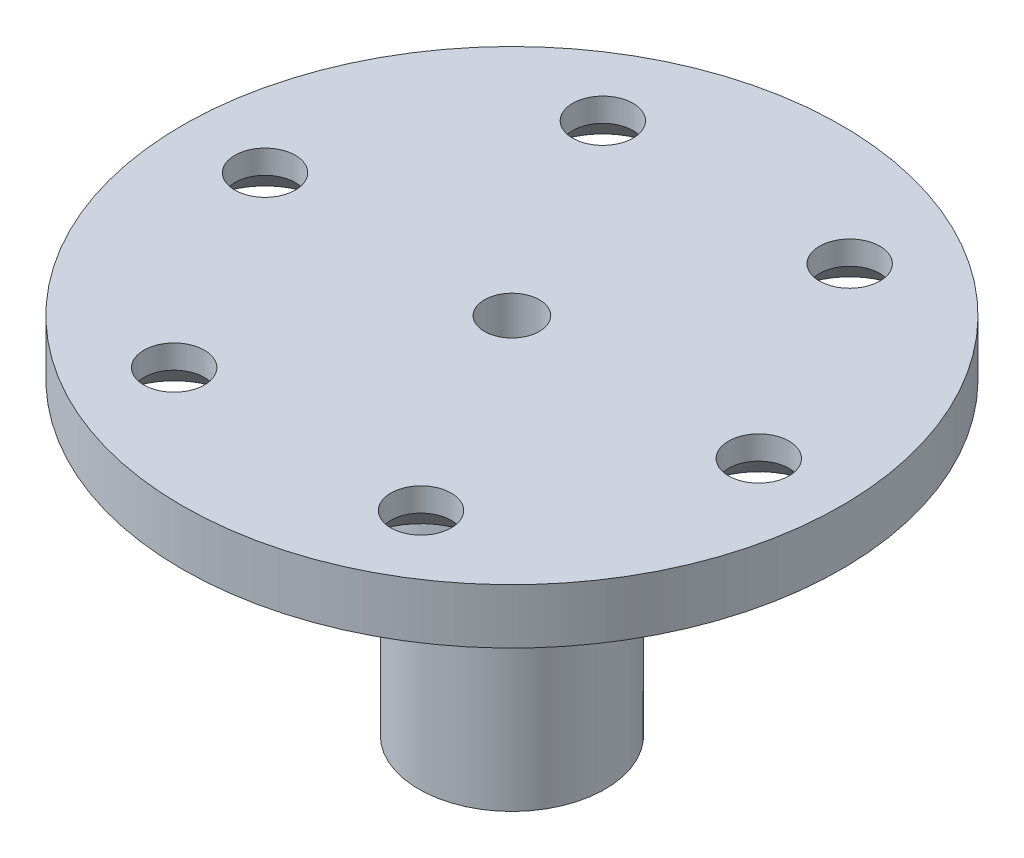
ISO-10303-21;
HEADER;
FILE_DESCRIPTION(('STEP AP214'),'2;1');
FILE_NAME('part.step','',(''),(''),'','','');
FILE_SCHEMA(('AUTOMOTIVE_DESIGN { 1 0 10303 214 1 1 1 1 }'));
ENDSEC;
DATA;
#1=APPLICATION_CONTEXT('core data for automotive mechanical design processes');
#2=APPLICATION_PROTOCOL_DEFINITION('international standard','automotive_design',2000,#1);
#3=PRODUCT_CONTEXT('',#1,'mechanical');
#4=PRODUCT('Part','Part','',(#3));
#5=PRODUCT_RELATED_PRODUCT_CATEGORY('part','',(#4));
#6=PRODUCT_DEFINITION_FORMATION('','',#4);
#7=PRODUCT_DEFINITION_CONTEXT('part definition',#1,'design');
#8=PRODUCT_DEFINITION('design','',#6,#7);
#9=PRODUCT_DEFINITION_SHAPE('','',#8);
#10=(LENGTH_UNIT() NAMED_UNIT(*) SI_UNIT(.MILLI.,.METRE.));
#11=(NAMED_UNIT(*) PLANE_ANGLE_UNIT() SI_UNIT($,.RADIAN.));
#12=(NAMED_UNIT(*) SI_UNIT($,.STERADIAN.) SOLID_ANGLE_UNIT());
#13=UNCERTAINTY_MEASURE_WITH_UNIT(LENGTH_MEASURE(1.E-05),#10,'distance_accuracy_value','');
#14=(GEOMETRIC_REPRESENTATION_CONTEXT(3) GLOBAL_UNCERTAINTY_ASSIGNED_CONTEXT((#13)) GLOBAL_UNIT_ASSIGNED_CONTEXT((#10,
#11,#12)) REPRESENTATION_CONTEXT('',''));
#15=CARTESIAN_POINT('',(0.,0.,0.));
#16=DIRECTION('',(0.,0.,1.));
#17=DIRECTION('',(1.,0.,0.));
#18=AXIS2_PLACEMENT_3D('',#15,#16,#17);
#19=CARTESIAN_POINT('',(0.,29.1,0.));
#20=DIRECTION('',(0.,1.,0.));
#21=DIRECTION('',(0.,0.,1.));
#22=AXIS2_PLACEMENT_3D('',#19,#20,#21);
#23=PLANE('',#22);
#24=CARTESIAN_POINT('',(0.,29.1,0.));
#25=DIRECTION('',(0.,1.,0.));
#26=DIRECTION('',(0.,0.,1.));
#27=AXIS2_PLACEMENT_3D('',#24,#25,#26);
#28=CIRCLE('',#27,30.);
#29=CARTESIAN_POINT('',(0.,29.1,30.));
#30=VERTEX_POINT('',#29);
#31=EDGE_CURVE('E235',#30,#30,#28,.T.);
#32=ORIENTED_EDGE('',*,*,#31,.T.);
#33=EDGE_LOOP('',(#32));
#34=FACE_BOUND('',#33,.T.);
#35=CARTESIAN_POINT('',(0.,29.1,0.));
#36=DIRECTION('',(0.,1.,0.));
#37=DIRECTION('',(0.,0.,1.));
#38=AXIS2_PLACEMENT_3D('',#35,#36,#37);
#39=CIRCLE('',#38,2.5);
#40=CARTESIAN_POINT('',(0.,29.1,2.5));
#41=VERTEX_POINT('',#40);
#42=EDGE_CURVE('E232',#41,#41,#39,.T.);
#43=ORIENTED_EDGE('',*,*,#42,.F.);
#44=EDGE_LOOP('',(#43));
#45=FACE_BOUND('',#44,.T.);
#46=CARTESIAN_POINT('',(-22.4999805563701,29.1,-0.0295797729116826));
#47=DIRECTION('',(0.,-1.,0.));
#48=DIRECTION('',(0.,0.,-1.));
#49=AXIS2_PLACEMENT_3D('',#46,#47,#48);
#50=CIRCLE('',#49,2.75);
#51=CARTESIAN_POINT('',(-22.4999805563701,29.1,-2.77957977291168));
#52=VERTEX_POINT('',#51);
#53=EDGE_CURVE('E229',#52,#52,#50,.T.);
#54=ORIENTED_EDGE('',*,*,#53,.T.);
#55=EDGE_LOOP('',(#54));
#56=FACE_BOUND('',#55,.T.);
#57=CARTESIAN_POINT('',(-11.2243734434054,29.1,-19.5003446329283));
#58=DIRECTION('',(0.,-1.,0.));
#59=DIRECTION('',(0.,0.,-1.));
#60=AXIS2_PLACEMENT_3D('',#57,#58,#59);
#61=CIRCLE('',#60,2.75);
#62=CARTESIAN_POINT('',(-11.2243734434054,29.1,-22.2503446329283));
#63=VERTEX_POINT('',#62);
#64=EDGE_CURVE('E220',#63,#63,#61,.T.);
#65=ORIENTED_EDGE('',*,*,#64,.T.);
#66=EDGE_LOOP('',(#65));
#67=FACE_BOUND('',#66,.T.);
#68=CARTESIAN_POINT('',(11.2756071129648,29.1,-19.4707648600166));
#69=DIRECTION('',(0.,-1.,0.));
#70=DIRECTION('',(0.,0.,-1.));
#71=AXIS2_PLACEMENT_3D('',#68,#69,#70);
#72=CIRCLE('',#71,2.75);
#73=CARTESIAN_POINT('',(11.2756071129648,29.1,-22.2207648600166));
#74=VERTEX_POINT('',#73);
#75=EDGE_CURVE('E211',#74,#74,#72,.T.);
#76=ORIENTED_EDGE('',*,*,#75,.T.);
#77=EDGE_LOOP('',(#76));
#78=FACE_BOUND('',#77,.T.);
#79=CARTESIAN_POINT('',(22.4999805563701,29.1,0.029579772911672));
#80=DIRECTION('',(0.,-1.,0.));
#81=DIRECTION('',(0.,0.,-1.));
#82=AXIS2_PLACEMENT_3D('',#79,#80,#81);
#83=CIRCLE('',#82,2.75);
#84=CARTESIAN_POINT('',(22.4999805563701,29.1,-2.72042022708833));
#85=VERTEX_POINT('',#84);
#86=EDGE_CURVE('E202',#85,#85,#83,.T.);
#87=ORIENTED_EDGE('',*,*,#86,.T.);
#88=EDGE_LOOP('',(#87));
#89=FACE_BOUND('',#88,.T.);
#90=CARTESIAN_POINT('',(11.2243734434054,29.1,19.5003446329283));
#91=DIRECTION('',(0.,-1.,0.));
#92=DIRECTION('',(0.,0.,-1.));
#93=AXIS2_PLACEMENT_3D('',#90,#91,#92);
#94=CIRCLE('',#93,2.75);
#95=CARTESIAN_POINT('',(11.2243734434054,29.1,16.7503446329283));
#96=VERTEX_POINT('',#95);
#97=EDGE_CURVE('E193',#96,#96,#94,.T.);
#98=ORIENTED_EDGE('',*,*,#97,.T.);
#99=EDGE_LOOP('',(#98));
#100=FACE_BOUND('',#99,.T.);
#101=CARTESIAN_POINT('',(-11.2756071129648,29.1,19.4707648600166));
#102=DIRECTION('',(0.,-1.,0.));
#103=DIRECTION('',(0.,0.,-1.));
#104=AXIS2_PLACEMENT_3D('',#101,#102,#103);
#105=CIRCLE('',#104,2.75);
#106=CARTESIAN_POINT('',(-11.2756071129648,29.1,16.7207648600166));
#107=VERTEX_POINT('',#106);
#108=EDGE_CURVE('E184',#107,#107,#105,.T.);
#109=ORIENTED_EDGE('',*,*,#108,.T.);
#110=EDGE_LOOP('',(#109));
#111=FACE_BOUND('',#110,.T.);
#112=ADVANCED_FACE('F38',(#34,#45,#56,#67,#78,#89,#100,#111),#23,.T.);
#113=CARTESIAN_POINT('',(0.,21.1,0.));
#114=DIRECTION('',(0.,1.,0.));
#115=DIRECTION('',(0.,0.,1.));
#116=AXIS2_PLACEMENT_3D('',#113,#114,#115);
#117=PLANE('',#116);
#118=CARTESIAN_POINT('',(0.,21.1,0.));
#119=DIRECTION('',(0.,1.,0.));
#120=DIRECTION('',(0.,0.,1.));
#121=AXIS2_PLACEMENT_3D('',#118,#119,#120);
#122=CIRCLE('',#121,12.5);
#123=CARTESIAN_POINT('',(0.,21.1,12.5));
#124=VERTEX_POINT('',#123);
#125=EDGE_CURVE('E83',#124,#124,#122,.T.);
#126=ORIENTED_EDGE('',*,*,#125,.F.);
#127=EDGE_LOOP('',(#126));
#128=FACE_BOUND('',#127,.T.);
#129=CARTESIAN_POINT('',(0.,21.1,0.));
#130=DIRECTION('',(0.,1.,0.));
#131=DIRECTION('',(0.,0.,1.));
#132=AXIS2_PLACEMENT_3D('',#129,#130,#131);
#133=CIRCLE('',#132,8.8);
#134=CARTESIAN_POINT('',(0.,21.1,8.8));
#135=VERTEX_POINT('',#134);
#136=EDGE_CURVE('E11',#135,#135,#133,.F.);
#137=ORIENTED_EDGE('',*,*,#136,.F.);
#138=EDGE_LOOP('',(#137));
#139=FACE_BOUND('',#138,.T.);
#140=ADVANCED_FACE('F119',(#128,#139),#117,.F.);
#141=CARTESIAN_POINT('',(0.,24.1,0.));
#142=DIRECTION('',(0.,-1.,0.));
#143=DIRECTION('',(0.,0.,-1.));
#144=AXIS2_PLACEMENT_3D('',#141,#142,#143);
#145=CYLINDRICAL_SURFACE('',#144,8.475);
#146=CARTESIAN_POINT('',(-8.40265977820583,10.,-1.10495866516446));
#147=CARTESIAN_POINT('',(-8.40266087968201,10.0698021096686,-1.10495575260072));
#148=CARTESIAN_POINT('',(-8.40343959515885,10.1396450759456,-1.09907774279233));
#149=CARTESIAN_POINT('',(-8.40645987454756,10.2773792495136,-1.07572796270456));
#150=CARTESIAN_POINT('',(-8.40870287629376,10.3452684698697,-1.05824479662926));
#151=CARTESIAN_POINT('',(-8.41436661369625,10.4770814922153,-1.01222204446264));
#152=CARTESIAN_POINT('',(-8.41778645663337,10.5410082567606,-0.983690837060908));
#153=CARTESIAN_POINT('',(-8.42537618391265,10.6631682440306,-0.916407125221118));
#154=CARTESIAN_POINT('',(-8.42954596228254,10.7214022693957,-0.877656064575271));
#155=CARTESIAN_POINT('',(-8.43814577096455,10.8309840493727,-0.790719075382072));
#156=CARTESIAN_POINT('',(-8.44257740354501,10.8822813243681,-0.742469669234943));
#157=CARTESIAN_POINT('',(-8.45110969247849,10.9760961628166,-0.638050632810637));
#158=CARTESIAN_POINT('',(-8.45521033081964,11.0186132486699,-0.58188057196774));
#159=CARTESIAN_POINT('',(-8.4625594986926,11.0938465481889,-0.462898840503435));
#160=CARTESIAN_POINT('',(-8.4658039848557,11.1265163555569,-0.400057553202238));
#161=CARTESIAN_POINT('',(-8.47095748332992,11.180829980343,-0.269726719038009));
#162=CARTESIAN_POINT('',(-8.47286656391731,11.2024743614508,-0.202237410011593));
#163=CARTESIAN_POINT('',(-8.47502585391505,11.2339699207795,-0.0650505909392129));
#164=CARTESIAN_POINT('',(-8.4752880060341,11.2439055763164,0.00462733051050558));
#165=CARTESIAN_POINT('',(-8.47405468213007,11.2519639016265,0.144645705771626));
#166=CARTESIAN_POINT('',(-8.47255930073161,11.2500872073462,0.214986123712338));
#167=CARTESIAN_POINT('',(-8.46789616018839,11.23464088347,0.353757257573251));
#168=CARTESIAN_POINT('',(-8.46474147318982,11.2211621348025,0.422198559194704));
#169=CARTESIAN_POINT('',(-8.45701954778459,11.1830369047029,0.55581164001434));
#170=CARTESIAN_POINT('',(-8.45245227400791,11.1583901436256,0.620983337296773));
#171=CARTESIAN_POINT('',(-8.44229612601306,11.0985350932331,0.746487534462836));
#172=CARTESIAN_POINT('',(-8.4367035692072,11.0632884293866,0.806801424520823));
#173=CARTESIAN_POINT('',(-8.42503714948996,10.983262102557,0.920682276639198));
#174=CARTESIAN_POINT('',(-8.41896325594732,10.9384818325692,0.974248808749486));
#175=CARTESIAN_POINT('',(-8.40686763789832,10.8401528650004,1.07365623236012));
#176=CARTESIAN_POINT('',(-8.40084695872408,10.7865248352207,1.11941881465837));
#177=CARTESIAN_POINT('',(-8.38952787631131,10.6722925047531,1.2013166081916));
#178=CARTESIAN_POINT('',(-8.38422947724583,10.6116881637628,1.2374517638044));
#179=CARTESIAN_POINT('',(-8.37490169239175,10.4851431993581,1.29908572786766));
#180=CARTESIAN_POINT('',(-8.3708732427825,10.4191986840822,1.32457669412337));
#181=CARTESIAN_POINT('',(-8.36451965781908,10.2838887107434,1.36412642662729));
#182=CARTESIAN_POINT('',(-8.36219440659687,10.2145234857331,1.37818597055867));
#183=CARTESIAN_POINT('',(-8.35951102423509,10.0750373488574,1.39437015523803));
#184=CARTESIAN_POINT('',(-8.35913465936228,10.0049296142079,1.39660542785582));
#185=CARTESIAN_POINT('',(-8.36033999190899,9.86533950735559,1.38937149181975));
#186=CARTESIAN_POINT('',(-8.36192163065461,9.79585711647639,1.3799026338941));
#187=CARTESIAN_POINT('',(-8.36686198726345,9.65983249494688,1.34962089609604));
#188=CARTESIAN_POINT('',(-8.37021209357493,9.59327769520735,1.32886297363424));
#189=CARTESIAN_POINT('',(-8.37833493480757,9.46460145689977,1.27664512342038));
#190=CARTESIAN_POINT('',(-8.38310773783679,9.40248023075457,1.24518468330165));
#191=CARTESIAN_POINT('',(-8.39362726551885,9.28393676385411,1.17218219507671));
#192=CARTESIAN_POINT('',(-8.39938083449809,9.22755935608675,1.13056834437198));
#193=CARTESIAN_POINT('',(-8.41125568515944,9.12256437675577,1.03853280728645));
#194=CARTESIAN_POINT('',(-8.41737698691136,9.07394722925538,0.988110639885974));
#195=CARTESIAN_POINT('',(-8.42943051223916,8.98545538718084,0.879394965283215));
#196=CARTESIAN_POINT('',(-8.4353608194275,8.94565414145514,0.821041419397263));
#197=CARTESIAN_POINT('',(-8.44639864564639,8.87643525951553,0.698398400154137));
#198=CARTESIAN_POINT('',(-8.45150618657243,8.84701734695492,0.634109084831656));
#199=CARTESIAN_POINT('',(-8.46039980760455,8.79951798300223,0.501644289965096));
#200=CARTESIAN_POINT('',(-8.46419057593625,8.7813961261953,0.433483624189252));
#201=CARTESIAN_POINT('',(-8.47014690048077,8.75687244361054,0.295017738543557));
#202=CARTESIAN_POINT('',(-8.47231256031506,8.75046987054093,0.22471265570526));
#203=CARTESIAN_POINT('',(-8.47486377929159,8.74958427740071,0.0846650136220495));
#204=CARTESIAN_POINT('',(-8.47526602695886,8.75498878245746,0.0149234434561492));
#205=CARTESIAN_POINT('',(-8.47439146987154,8.77732315752283,-0.122676588822249));
#206=CARTESIAN_POINT('',(-8.47311466997503,8.79425299418463,-0.190535056382632));
#207=CARTESIAN_POINT('',(-8.46912211936292,8.83911803405105,-0.322409941370452));
#208=CARTESIAN_POINT('',(-8.46640735310778,8.86704570456749,-0.3864289540252));
#209=CARTESIAN_POINT('',(-8.4599292748322,8.93310170420444,-0.508908055053001));
#210=CARTESIAN_POINT('',(-8.45616593104755,8.97123034233808,-0.567367974954344));
#211=CARTESIAN_POINT('',(-8.44804861389263,9.05701371281035,-0.677634417512913));
#212=CARTESIAN_POINT('',(-8.44368960122369,9.10475157284222,-0.729375904548525));
#213=CARTESIAN_POINT('',(-8.43496680683743,9.20822345584385,-0.82415486816626));
#214=CARTESIAN_POINT('',(-8.43060302424051,9.26395935414369,-0.86719029768751));
#215=CARTESIAN_POINT('',(-8.42240168433913,9.38219974561723,-0.943536734886247));
#216=CARTESIAN_POINT('',(-8.41856710791588,9.44473929314397,-0.976793762235833));
#217=CARTESIAN_POINT('',(-8.41194648553177,9.57453945322262,-1.03226377946709));
#218=CARTESIAN_POINT('',(-8.40915934648421,9.64179505669351,-1.05448829050196));
#219=CARTESIAN_POINT('',(-8.40563072751669,9.75779827786002,-1.08218348870219));
#220=CARTESIAN_POINT('',(-8.40452304082223,9.80582763510222,-1.09071111695953));
#221=CARTESIAN_POINT('',(-8.40303718619518,9.90256469707029,-1.1020996869273));
#222=CARTESIAN_POINT('',(-8.40265900928497,9.95127239344085,-1.10496069837321));
#223=CARTESIAN_POINT('',(-8.40265977820583,10.,-1.10495866516446));
#224=B_SPLINE_CURVE_WITH_KNOTS('',3,(#146,#147,#148,#149,#150,#151,#152,#153,#154,#155,#156,
#157,#158,#159,#160,#161,#162,#163,#164,#165,#166,#167,#168,#169,#170,#171,#172,#173,#174,#175,
#176,#177,#178,#179,#180,#181,#182,#183,#184,#185,#186,#187,#188,#189,#190,#191,#192,#193,#194,
#195,#196,#197,#198,#199,#200,#201,#202,#203,#204,#205,#206,#207,#208,#209,#210,#211,#212,#213,
#214,#215,#216,#217,#218,#219,#220,#221,#222,#223),.UNSPECIFIED.,.T.,.F.,(4,2,2,2,2,2,2,2,2,2,2,
2,2,2,2,2,2,2,2,2,2,2,2,2,2,2,2,2,2,2,2,2,2,2,2,2,2,2,4),(0.,0.209228234804428,
0.418662227840657,0.627937698979362,0.837183620907765,1.04787855840323,1.25858495366544,
1.47026933401834,1.68194289063875,1.89207970670995,2.10220520965189,2.31069958764902,
2.51919918659995,2.72846288820105,2.93773991760895,3.14900702312179,3.36027534919782,
3.57169905549333,3.78310837736571,3.99253613797856,4.20195762299095,4.41036861154315,
4.61878957885733,4.82872949346955,5.03868087642699,5.25032063964812,5.46195476976878,
5.67282748480104,5.88368675285678,6.09254612939411,6.30140490163061,6.5101208694491,
6.71884316051832,6.92945531836829,7.14011694017843,7.35192054922559,7.56350250599205,
7.70956279876965,7.85562129406471),.UNSPECIFIED.);
#225=CARTESIAN_POINT('',(-8.40265977820583,10.,-1.10495866516446));
#226=VERTEX_POINT('',#225);
#227=EDGE_CURVE('E93',#226,#226,#224,.T.);
#228=ORIENTED_EDGE('',*,*,#227,.T.);
#229=EDGE_LOOP('',(#228));
#230=FACE_BOUND('',#229,.T.);
#231=CARTESIAN_POINT('',(0.,20.1,0.));
#232=DIRECTION('',(0.,-1.,0.));
#233=DIRECTION('',(0.,0.,-1.));
#234=AXIS2_PLACEMENT_3D('',#231,#232,#233);
#235=CIRCLE('',#234,8.475);
#236=CARTESIAN_POINT('',(0.,20.1,-8.475));
#237=VERTEX_POINT('',#236);
#238=EDGE_CURVE('E99',#237,#237,#235,.T.);
#239=ORIENTED_EDGE('',*,*,#238,.T.);
#240=EDGE_LOOP('',(#239));
#241=FACE_BOUND('',#240,.T.);
#242=CARTESIAN_POINT('',(0.,-4.,0.));
#243=DIRECTION('',(0.,-1.,0.));
#244=DIRECTION('',(0.,0.,-1.));
#245=AXIS2_PLACEMENT_3D('',#242,#243,#244);
#246=CIRCLE('',#245,8.475);
#247=CARTESIAN_POINT('',(0.,-4.,-8.475));
#248=VERTEX_POINT('',#247);
#249=EDGE_CURVE('E173',#248,#248,#246,.T.);
#250=ORIENTED_EDGE('',*,*,#249,.F.);
#251=EDGE_LOOP('',(#250));
#252=FACE_BOUND('',#251,.T.);
#253=ADVANCED_FACE('F40',(#230,#241,#252),#145,.T.);
#254=CARTESIAN_POINT('',(0.,0.,0.));
#255=DIRECTION('',(0.,1.,0.));
#256=DIRECTION('',(0.,0.,1.));
#257=AXIS2_PLACEMENT_3D('',#254,#255,#256);
#258=PLANE('',#257);
#259=DIRECTION('',(0.0172809966681142,0.,0.999850672427716));
#260=VECTOR('',#259,1.);
#261=CARTESIAN_POINT('',(-3.94721593071872,0.,3.0691181789368));
#262=LINE('',#261,#260);
#263=CARTESIAN_POINT('',(-4.05091739621549,0.,-2.9308818210632));
#264=VERTEX_POINT('',#263);
#265=CARTESIAN_POINT('',(-3.94721593071872,0.,3.0691181789368));
#266=VERTEX_POINT('',#265);
#267=EDGE_CURVE('E71',#264,#266,#262,.T.);
#268=ORIENTED_EDGE('',*,*,#267,.T.);
#269=CARTESIAN_POINT('',(0.,0.,0.));
#270=DIRECTION('',(0.,-1.,0.));
#271=DIRECTION('',(0.,0.,-1.));
#272=AXIS2_PLACEMENT_3D('',#269,#270,#271);
#273=CIRCLE('',#272,5.);
#274=EDGE_CURVE('E68',#266,#264,#273,.T.);
#275=ORIENTED_EDGE('',*,*,#274,.T.);
#276=EDGE_LOOP('',(#268,#275));
#277=FACE_BOUND('',#276,.T.);
#278=ADVANCED_FACE('F69',(#277),#258,.F.);
#279=CARTESIAN_POINT('',(0.,24.101,0.));
#280=DIRECTION('',(0.,-1.,0.));
#281=DIRECTION('',(0.,0.,-1.));
#282=AXIS2_PLACEMENT_3D('',#279,#280,#281);
#283=CYLINDRICAL_SURFACE('',#282,5.);
#284=DIRECTION('',(0.,-1.,0.));
#285=VECTOR('',#284,1.);
#286=CARTESIAN_POINT('',(-4.05091739621549,22.,-2.9308818210632));
#287=LINE('',#286,#285);
#288=CARTESIAN_POINT('',(-4.05091739621549,22.,-2.9308818210632));
#289=VERTEX_POINT('',#288);
#290=EDGE_CURVE('E74',#289,#264,#287,.T.);
#291=ORIENTED_EDGE('',*,*,#290,.T.);
#292=ORIENTED_EDGE('',*,*,#274,.F.);
#293=DIRECTION('',(0.,-1.,0.));
#294=VECTOR('',#293,1.);
#295=CARTESIAN_POINT('',(-3.94721593071872,22.,3.0691181789368));
#296=LINE('',#295,#294);
#297=CARTESIAN_POINT('',(-3.94721593071872,22.,3.0691181789368));
#298=VERTEX_POINT('',#297);
#299=EDGE_CURVE('E61',#298,#266,#296,.T.);
#300=ORIENTED_EDGE('',*,*,#299,.F.);
#301=CARTESIAN_POINT('',(1.43114686768087E-13,22.,0.));
#302=DIRECTION('',(0.,-1.,0.));
#303=DIRECTION('',(0.,0.,1.));
#304=AXIS2_PLACEMENT_3D('',#301,#302,#303);
#305=CIRCLE('',#304,5.00000000000011);
#306=EDGE_CURVE('E56',#298,#289,#305,.T.);
#307=ORIENTED_EDGE('',*,*,#306,.T.);
#308=EDGE_LOOP('',(#291,#292,#300,#307));
#309=FACE_BOUND('',#308,.T.);
#310=CARTESIAN_POINT('',(0.,24.1,0.));
#311=DIRECTION('',(0.,1.,0.));
#312=DIRECTION('',(0.,0.,1.));
#313=AXIS2_PLACEMENT_3D('',#310,#311,#312);
#314=CIRCLE('',#313,5.);
#315=CARTESIAN_POINT('',(0.,24.1,5.));
#316=VERTEX_POINT('',#315);
#317=EDGE_CURVE('E48',#316,#316,#314,.F.);
#318=ORIENTED_EDGE('',*,*,#317,.F.);
#319=EDGE_LOOP('',(#318));
#320=FACE_BOUND('',#319,.T.);
#321=CARTESIAN_POINT('',(0.,-4.,0.));
#322=DIRECTION('',(0.,-1.,0.));
#323=DIRECTION('',(0.,0.,-1.));
#324=AXIS2_PLACEMENT_3D('',#321,#322,#323);
#325=CIRCLE('',#324,5.);
#326=CARTESIAN_POINT('',(0.,-4.,-5.));
#327=VERTEX_POINT('',#326);
#328=EDGE_CURVE('E72',#327,#327,#325,.T.);
#329=ORIENTED_EDGE('',*,*,#328,.T.);
#330=EDGE_LOOP('',(#329));
#331=FACE_BOUND('',#330,.T.);
#332=ADVANCED_FACE('F75',(#309,#320,#331),#283,.F.);
#333=CARTESIAN_POINT('',(-3.94721593071872,22.,3.0691181789368));
#334=DIRECTION('',(0.999850672427716,0.,-0.0172809966681142));
#335=DIRECTION('',(-0.0172809966681142,0.,-0.999850672427716));
#336=AXIS2_PLACEMENT_3D('',#333,#334,#335);
#337=PLANE('',#336);
#338=CARTESIAN_POINT('',(-3.9990666634671,10.,0.0691181789368023));
#339=DIRECTION('',(0.999850672427717,0.,-0.0172809966681142));
#340=DIRECTION('',(-0.0172809966681142,0.,-0.999850672427717));
#341=AXIS2_PLACEMENT_3D('',#338,#339,#340);
#342=CIRCLE('',#341,1.24999999999999);
#343=CARTESIAN_POINT('',(-4.02066790930225,10.,-1.18069516159783));
#344=VERTEX_POINT('',#343);
#345=EDGE_CURVE('E100',#344,#344,#342,.T.);
#346=ORIENTED_EDGE('',*,*,#345,.F.);
#347=EDGE_LOOP('',(#346));
#348=FACE_BOUND('',#347,.T.);
#349=ORIENTED_EDGE('',*,*,#267,.F.);
#350=ORIENTED_EDGE('',*,*,#290,.F.);
#351=DIRECTION('',(0.0172809966681142,0.,0.999850672427716));
#352=VECTOR('',#351,1.);
#353=CARTESIAN_POINT('',(-3.94721593071872,22.,3.0691181789368));
#354=LINE('',#353,#352);
#355=EDGE_CURVE('E80',#289,#298,#354,.T.);
#356=ORIENTED_EDGE('',*,*,#355,.T.);
#357=ORIENTED_EDGE('',*,*,#299,.T.);
#358=EDGE_LOOP('',(#349,#350,#356,#357));
#359=FACE_BOUND('',#358,.T.);
#360=ADVANCED_FACE('F82',(#348,#359),#337,.T.);
#361=CARTESIAN_POINT('',(1.43114686768087E-13,22.,0.));
#362=DIRECTION('',(0.,1.,0.));
#363=DIRECTION('',(0.,0.,1.));
#364=AXIS2_PLACEMENT_3D('',#361,#362,#363);
#365=PLANE('',#364);
#366=ORIENTED_EDGE('',*,*,#306,.F.);
#367=ORIENTED_EDGE('',*,*,#355,.F.);
#368=EDGE_LOOP('',(#366,#367));
#369=FACE_BOUND('',#368,.T.);
#370=ADVANCED_FACE('F125',(#369),#365,.T.);
#371=CARTESIAN_POINT('',(0.,21.1,0.));
#372=DIRECTION('',(0.,1.,0.));
#373=DIRECTION('',(0.,0.,1.));
#374=AXIS2_PLACEMENT_3D('',#371,#372,#373);
#375=CYLINDRICAL_SURFACE('',#374,12.5);
#376=ORIENTED_EDGE('',*,*,#125,.T.);
#377=EDGE_LOOP('',(#376));
#378=FACE_BOUND('',#377,.T.);
#379=CARTESIAN_POINT('',(0.,24.1,0.));
#380=DIRECTION('',(0.,1.,0.));
#381=DIRECTION('',(0.,0.,1.));
#382=AXIS2_PLACEMENT_3D('',#379,#380,#381);
#383=CIRCLE('',#382,12.5);
#384=CARTESIAN_POINT('',(0.,24.1,12.5));
#385=VERTEX_POINT('',#384);
#386=EDGE_CURVE('E87',#385,#385,#383,.T.);
#387=ORIENTED_EDGE('',*,*,#386,.F.);
#388=EDGE_LOOP('',(#387));
#389=FACE_BOUND('',#388,.T.);
#390=ADVANCED_FACE('F114',(#378,#389),#375,.T.);
#391=CARTESIAN_POINT('',(0.,20.1,0.));
#392=DIRECTION('',(0.,-1.,0.));
#393=DIRECTION('',(0.,0.,-1.));
#394=AXIS2_PLACEMENT_3D('',#391,#392,#393);
#395=PLANE('',#394);
#396=CARTESIAN_POINT('',(0.,20.1,0.));
#397=DIRECTION('',(0.,-1.,0.));
#398=DIRECTION('',(0.,0.,-1.));
#399=AXIS2_PLACEMENT_3D('',#396,#397,#398);
#400=CIRCLE('',#399,8.8);
#401=CARTESIAN_POINT('',(0.,20.1,-8.8));
#402=VERTEX_POINT('',#401);
#403=EDGE_CURVE('E244',#402,#402,#400,.T.);
#404=ORIENTED_EDGE('',*,*,#403,.T.);
#405=EDGE_LOOP('',(#404));
#406=FACE_BOUND('',#405,.T.);
#407=ORIENTED_EDGE('',*,*,#238,.F.);
#408=EDGE_LOOP('',(#407));
#409=FACE_BOUND('',#408,.T.);
#410=ADVANCED_FACE('F111',(#406,#409),#395,.T.);
#411=CARTESIAN_POINT('',(0.,20.1,0.));
#412=DIRECTION('',(0.,1.,0.));
#413=DIRECTION('',(0.,0.,1.));
#414=AXIS2_PLACEMENT_3D('',#411,#412,#413);
#415=CYLINDRICAL_SURFACE('',#414,8.8);
#416=ORIENTED_EDGE('',*,*,#403,.F.);
#417=EDGE_LOOP('',(#416));
#418=FACE_BOUND('',#417,.T.);
#419=ORIENTED_EDGE('',*,*,#136,.T.);
#420=EDGE_LOOP('',(#419));
#421=FACE_BOUND('',#420,.T.);
#422=ADVANCED_FACE('F107',(#418,#421),#415,.T.);
#423=CARTESIAN_POINT('',(-3.9990666634671,10.,0.0691181789368024));
#424=DIRECTION('',(0.999850672427717,0.,-0.0172809966681142));
#425=DIRECTION('',(-0.0172809966681142,0.,-0.999850672427717));
#426=AXIS2_PLACEMENT_3D('',#423,#424,#425);
#427=CYLINDRICAL_SURFACE('',#426,1.24999999999999);
#428=ORIENTED_EDGE('',*,*,#345,.T.);
#429=EDGE_LOOP('',(#428));
#430=FACE_BOUND('',#429,.T.);
#431=ORIENTED_EDGE('',*,*,#227,.F.);
#432=EDGE_LOOP('',(#431));
#433=FACE_BOUND('',#432,.T.);
#434=ADVANCED_FACE('F101',(#430,#433),#427,.F.);
#435=CARTESIAN_POINT('',(0.,24.1,0.));
#436=DIRECTION('',(0.,1.,0.));
#437=DIRECTION('',(0.,0.,1.));
#438=AXIS2_PLACEMENT_3D('',#435,#436,#437);
#439=PLANE('',#438);
#440=CARTESIAN_POINT('',(-11.2756071129648,24.1,19.4707648600166));
#441=DIRECTION('',(0.,-1.,0.));
#442=DIRECTION('',(0.,0.,-1.));
#443=AXIS2_PLACEMENT_3D('',#440,#441,#442);
#444=CIRCLE('',#443,5.6);
#445=CARTESIAN_POINT('',(-11.2756071129648,24.1,13.8707648600166));
#446=VERTEX_POINT('',#445);
#447=EDGE_CURVE('E176',#446,#446,#444,.T.);
#448=ORIENTED_EDGE('',*,*,#447,.F.);
#449=EDGE_LOOP('',(#448));
#450=FACE_BOUND('',#449,.T.);
#451=CARTESIAN_POINT('',(11.2243734434054,24.1,19.5003446329283));
#452=DIRECTION('',(0.,-1.,0.));
#453=DIRECTION('',(0.,0.,-1.));
#454=AXIS2_PLACEMENT_3D('',#451,#452,#453);
#455=CIRCLE('',#454,5.6);
#456=CARTESIAN_POINT('',(11.2243734434054,24.1,13.9003446329283));
#457=VERTEX_POINT('',#456);
#458=EDGE_CURVE('E187',#457,#457,#455,.T.);
#459=ORIENTED_EDGE('',*,*,#458,.F.);
#460=EDGE_LOOP('',(#459));
#461=FACE_BOUND('',#460,.T.);
#462=CARTESIAN_POINT('',(22.4999805563701,24.1,0.029579772911672));
#463=DIRECTION('',(0.,-1.,0.));
#464=DIRECTION('',(0.,0.,-1.));
#465=AXIS2_PLACEMENT_3D('',#462,#463,#464);
#466=CIRCLE('',#465,5.6);
#467=CARTESIAN_POINT('',(22.4999805563701,24.1,-5.57042022708833));
#468=VERTEX_POINT('',#467);
#469=EDGE_CURVE('E196',#468,#468,#466,.T.);
#470=ORIENTED_EDGE('',*,*,#469,.F.);
#471=EDGE_LOOP('',(#470));
#472=FACE_BOUND('',#471,.T.);
#473=CARTESIAN_POINT('',(11.2756071129648,24.1,-19.4707648600166));
#474=DIRECTION('',(0.,-1.,0.));
#475=DIRECTION('',(0.,0.,-1.));
#476=AXIS2_PLACEMENT_3D('',#473,#474,#475);
#477=CIRCLE('',#476,5.6);
#478=CARTESIAN_POINT('',(11.2756071129648,24.1,-25.0707648600166));
#479=VERTEX_POINT('',#478);
#480=EDGE_CURVE('E205',#479,#479,#477,.T.);
#481=ORIENTED_EDGE('',*,*,#480,.F.);
#482=EDGE_LOOP('',(#481));
#483=FACE_BOUND('',#482,.T.);
#484=CARTESIAN_POINT('',(-11.2243734434054,24.1,-19.5003446329283));
#485=DIRECTION('',(0.,-1.,0.));
#486=DIRECTION('',(0.,0.,-1.));
#487=AXIS2_PLACEMENT_3D('',#484,#485,#486);
#488=CIRCLE('',#487,5.6);
#489=CARTESIAN_POINT('',(-11.2243734434054,24.1,-25.1003446329283));
#490=VERTEX_POINT('',#489);
#491=EDGE_CURVE('E214',#490,#490,#488,.T.);
#492=ORIENTED_EDGE('',*,*,#491,.F.);
#493=EDGE_LOOP('',(#492));
#494=FACE_BOUND('',#493,.T.);
#495=CARTESIAN_POINT('',(-22.4999805563701,24.1,-0.0295797729116826));
#496=DIRECTION('',(0.,-1.,0.));
#497=DIRECTION('',(0.,0.,-1.));
#498=AXIS2_PLACEMENT_3D('',#495,#496,#497);
#499=CIRCLE('',#498,5.6);
#500=CARTESIAN_POINT('',(-22.4999805563701,24.1,-5.62957977291168));
#501=VERTEX_POINT('',#500);
#502=EDGE_CURVE('E223',#501,#501,#499,.T.);
#503=ORIENTED_EDGE('',*,*,#502,.F.);
#504=EDGE_LOOP('',(#503));
#505=FACE_BOUND('',#504,.T.);
#506=ORIENTED_EDGE('',*,*,#386,.T.);
#507=EDGE_LOOP('',(#506));
#508=FACE_BOUND('',#507,.T.);
#509=CARTESIAN_POINT('',(0.,24.1,0.));
#510=DIRECTION('',(0.,1.,0.));
#511=DIRECTION('',(0.,0.,1.));
#512=AXIS2_PLACEMENT_3D('',#509,#510,#511);
#513=CIRCLE('',#512,30.);
#514=CARTESIAN_POINT('',(0.,24.1,30.));
#515=VERTEX_POINT('',#514);
#516=EDGE_CURVE('E237',#515,#515,#513,.T.);
#517=ORIENTED_EDGE('',*,*,#516,.F.);
#518=EDGE_LOOP('',(#517));
#519=FACE_BOUND('',#518,.T.);
#520=ADVANCED_FACE('F106',(#450,#461,#472,#483,#494,#505,#508,#519),#439,.F.);
#521=CARTESIAN_POINT('',(0.,29.1,0.));
#522=DIRECTION('',(0.,-1.,0.));
#523=DIRECTION('',(0.,0.,-1.));
#524=AXIS2_PLACEMENT_3D('',#521,#522,#523);
#525=CYLINDRICAL_SURFACE('',#524,30.);
#526=ORIENTED_EDGE('',*,*,#31,.F.);
#527=EDGE_LOOP('',(#526));
#528=FACE_BOUND('',#527,.T.);
#529=ORIENTED_EDGE('',*,*,#516,.T.);
#530=EDGE_LOOP('',(#529));
#531=FACE_BOUND('',#530,.T.);
#532=ADVANCED_FACE('F109',(#528,#531),#525,.T.);
#533=CARTESIAN_POINT('',(0.,24.1,0.));
#534=DIRECTION('',(0.,1.,0.));
#535=DIRECTION('',(0.,0.,1.));
#536=AXIS2_PLACEMENT_3D('',#533,#534,#535);
#537=CIRCLE('',#536,2.5);
#538=CARTESIAN_POINT('',(0.,24.1,2.5));
#539=VERTEX_POINT('',#538);
#540=EDGE_CURVE('E43',#539,#539,#537,.T.);
#541=ORIENTED_EDGE('',*,*,#540,.T.);
#542=EDGE_LOOP('',(#541));
#543=FACE_BOUND('',#542,.T.);
#544=ORIENTED_EDGE('',*,*,#317,.T.);
#545=EDGE_LOOP('',(#544));
#546=FACE_BOUND('',#545,.T.);
#547=ADVANCED_FACE('F151',(#543,#546),#439,.F.);
#548=CARTESIAN_POINT('',(0.,19.1,0.));
#549=DIRECTION('',(0.,1.,0.));
#550=DIRECTION('',(0.,0.,1.));
#551=AXIS2_PLACEMENT_3D('',#548,#549,#550);
#552=CYLINDRICAL_SURFACE('',#551,2.5);
#553=ORIENTED_EDGE('',*,*,#42,.T.);
#554=EDGE_LOOP('',(#553));
#555=FACE_BOUND('',#554,.T.);
#556=ORIENTED_EDGE('',*,*,#540,.F.);
#557=EDGE_LOOP('',(#556));
#558=FACE_BOUND('',#557,.T.);
#559=ADVANCED_FACE('F147',(#555,#558),#552,.F.);
#560=CARTESIAN_POINT('',(-22.4999805563701,24.1,-0.0295797729116826));
#561=DIRECTION('',(0.,-1.,0.));
#562=DIRECTION('',(0.,0.,-1.));
#563=AXIS2_PLACEMENT_3D('',#560,#561,#562);
#564=CYLINDRICAL_SURFACE('',#563,2.75);
#565=ORIENTED_EDGE('',*,*,#53,.F.);
#566=EDGE_LOOP('',(#565));
#567=FACE_BOUND('',#566,.T.);
#568=CARTESIAN_POINT('',(-22.4999805563701,26.95,-0.0295797729116826));
#569=DIRECTION('',(0.,-1.,0.));
#570=DIRECTION('',(0.,0.,-1.));
#571=AXIS2_PLACEMENT_3D('',#568,#569,#570);
#572=CIRCLE('',#571,2.75);
#573=CARTESIAN_POINT('',(-22.4999805563701,26.95,-2.77957977291168));
#574=VERTEX_POINT('',#573);
#575=EDGE_CURVE('E226',#574,#574,#572,.T.);
#576=ORIENTED_EDGE('',*,*,#575,.T.);
#577=EDGE_LOOP('',(#576));
#578=FACE_BOUND('',#577,.T.);
#579=ADVANCED_FACE('F163',(#567,#578),#564,.F.);
#580=CARTESIAN_POINT('',(-22.4999805563701,24.1,-0.0295797729116826));
#581=DIRECTION('',(0.,-1.,0.));
#582=DIRECTION('',(0.,0.,-1.));
#583=AXIS2_PLACEMENT_3D('',#580,#581,#582);
#584=CONICAL_SURFACE('',#583,5.6,0.785398163397449);
#585=ORIENTED_EDGE('',*,*,#575,.F.);
#586=EDGE_LOOP('',(#585));
#587=FACE_BOUND('',#586,.T.);
#588=ORIENTED_EDGE('',*,*,#502,.T.);
#589=EDGE_LOOP('',(#588));
#590=FACE_BOUND('',#589,.T.);
#591=ADVANCED_FACE('F309',(#587,#590),#584,.F.);
#592=CARTESIAN_POINT('',(-11.2243734434054,24.1,-19.5003446329283));
#593=DIRECTION('',(0.,-1.,0.));
#594=DIRECTION('',(0.,0.,-1.));
#595=AXIS2_PLACEMENT_3D('',#592,#593,#594);
#596=CYLINDRICAL_SURFACE('',#595,2.75);
#597=ORIENTED_EDGE('',*,*,#64,.F.);
#598=EDGE_LOOP('',(#597));
#599=FACE_BOUND('',#598,.T.);
#600=CARTESIAN_POINT('',(-11.2243734434054,26.95,-19.5003446329283));
#601=DIRECTION('',(0.,-1.,0.));
#602=DIRECTION('',(0.,0.,-1.));
#603=AXIS2_PLACEMENT_3D('',#600,#601,#602);
#604=CIRCLE('',#603,2.75);
#605=CARTESIAN_POINT('',(-11.2243734434054,26.95,-22.2503446329283));
#606=VERTEX_POINT('',#605);
#607=EDGE_CURVE('E217',#606,#606,#604,.T.);
#608=ORIENTED_EDGE('',*,*,#607,.T.);
#609=EDGE_LOOP('',(#608));
#610=FACE_BOUND('',#609,.T.);
#611=ADVANCED_FACE('F305',(#599,#610),#596,.F.);
#612=CARTESIAN_POINT('',(-11.2243734434054,24.1,-19.5003446329283));
#613=DIRECTION('',(0.,-1.,0.));
#614=DIRECTION('',(0.,0.,-1.));
#615=AXIS2_PLACEMENT_3D('',#612,#613,#614);
#616=CONICAL_SURFACE('',#615,5.6,0.785398163397449);
#617=ORIENTED_EDGE('',*,*,#607,.F.);
#618=EDGE_LOOP('',(#617));
#619=FACE_BOUND('',#618,.T.);
#620=ORIENTED_EDGE('',*,*,#491,.T.);
#621=EDGE_LOOP('',(#620));
#622=FACE_BOUND('',#621,.T.);
#623=ADVANCED_FACE('F301',(#619,#622),#616,.F.);
#624=CARTESIAN_POINT('',(11.2756071129648,24.1,-19.4707648600166));
#625=DIRECTION('',(0.,-1.,0.));
#626=DIRECTION('',(0.,0.,-1.));
#627=AXIS2_PLACEMENT_3D('',#624,#625,#626);
#628=CYLINDRICAL_SURFACE('',#627,2.75);
#629=ORIENTED_EDGE('',*,*,#75,.F.);
#630=EDGE_LOOP('',(#629));
#631=FACE_BOUND('',#630,.T.);
#632=CARTESIAN_POINT('',(11.2756071129648,26.95,-19.4707648600166));
#633=DIRECTION('',(0.,-1.,0.));
#634=DIRECTION('',(0.,0.,-1.));
#635=AXIS2_PLACEMENT_3D('',#632,#633,#634);
#636=CIRCLE('',#635,2.75);
#637=CARTESIAN_POINT('',(11.2756071129648,26.95,-22.2207648600166));
#638=VERTEX_POINT('',#637);
#639=EDGE_CURVE('E208',#638,#638,#636,.T.);
#640=ORIENTED_EDGE('',*,*,#639,.T.);
#641=EDGE_LOOP('',(#640));
#642=FACE_BOUND('',#641,.T.);
#643=ADVANCED_FACE('F297',(#631,#642),#628,.F.);
#644=CARTESIAN_POINT('',(11.2756071129648,24.1,-19.4707648600166));
#645=DIRECTION('',(0.,-1.,0.));
#646=DIRECTION('',(0.,0.,-1.));
#647=AXIS2_PLACEMENT_3D('',#644,#645,#646);
#648=CONICAL_SURFACE('',#647,5.6,0.785398163397449);
#649=ORIENTED_EDGE('',*,*,#639,.F.);
#650=EDGE_LOOP('',(#649));
#651=FACE_BOUND('',#650,.T.);
#652=ORIENTED_EDGE('',*,*,#480,.T.);
#653=EDGE_LOOP('',(#652));
#654=FACE_BOUND('',#653,.T.);
#655=ADVANCED_FACE('F293',(#651,#654),#648,.F.);
#656=CARTESIAN_POINT('',(22.4999805563701,24.1,0.029579772911672));
#657=DIRECTION('',(0.,-1.,0.));
#658=DIRECTION('',(0.,0.,-1.));
#659=AXIS2_PLACEMENT_3D('',#656,#657,#658);
#660=CYLINDRICAL_SURFACE('',#659,2.75);
#661=ORIENTED_EDGE('',*,*,#86,.F.);
#662=EDGE_LOOP('',(#661));
#663=FACE_BOUND('',#662,.T.);
#664=CARTESIAN_POINT('',(22.4999805563701,26.95,0.029579772911672));
#665=DIRECTION('',(0.,-1.,0.));
#666=DIRECTION('',(0.,0.,-1.));
#667=AXIS2_PLACEMENT_3D('',#664,#665,#666);
#668=CIRCLE('',#667,2.75);
#669=CARTESIAN_POINT('',(22.4999805563701,26.95,-2.72042022708833));
#670=VERTEX_POINT('',#669);
#671=EDGE_CURVE('E199',#670,#670,#668,.T.);
#672=ORIENTED_EDGE('',*,*,#671,.T.);
#673=EDGE_LOOP('',(#672));
#674=FACE_BOUND('',#673,.T.);
#675=ADVANCED_FACE('F289',(#663,#674),#660,.F.);
#676=CARTESIAN_POINT('',(22.4999805563701,24.1,0.029579772911672));
#677=DIRECTION('',(0.,-1.,0.));
#678=DIRECTION('',(0.,0.,-1.));
#679=AXIS2_PLACEMENT_3D('',#676,#677,#678);
#680=CONICAL_SURFACE('',#679,5.6,0.785398163397449);
#681=ORIENTED_EDGE('',*,*,#671,.F.);
#682=EDGE_LOOP('',(#681));
#683=FACE_BOUND('',#682,.T.);
#684=ORIENTED_EDGE('',*,*,#469,.T.);
#685=EDGE_LOOP('',(#684));
#686=FACE_BOUND('',#685,.T.);
#687=ADVANCED_FACE('F285',(#683,#686),#680,.F.);
#688=CARTESIAN_POINT('',(11.2243734434054,24.1,19.5003446329283));
#689=DIRECTION('',(0.,-1.,0.));
#690=DIRECTION('',(0.,0.,-1.));
#691=AXIS2_PLACEMENT_3D('',#688,#689,#690);
#692=CYLINDRICAL_SURFACE('',#691,2.75);
#693=ORIENTED_EDGE('',*,*,#97,.F.);
#694=EDGE_LOOP('',(#693));
#695=FACE_BOUND('',#694,.T.);
#696=CARTESIAN_POINT('',(11.2243734434054,26.95,19.5003446329283));
#697=DIRECTION('',(0.,-1.,0.));
#698=DIRECTION('',(0.,0.,-1.));
#699=AXIS2_PLACEMENT_3D('',#696,#697,#698);
#700=CIRCLE('',#699,2.75);
#701=CARTESIAN_POINT('',(11.2243734434054,26.95,16.7503446329283));
#702=VERTEX_POINT('',#701);
#703=EDGE_CURVE('E190',#702,#702,#700,.T.);
#704=ORIENTED_EDGE('',*,*,#703,.T.);
#705=EDGE_LOOP('',(#704));
#706=FACE_BOUND('',#705,.T.);
#707=ADVANCED_FACE('F281',(#695,#706),#692,.F.);
#708=CARTESIAN_POINT('',(11.2243734434054,24.1,19.5003446329283));
#709=DIRECTION('',(0.,-1.,0.));
#710=DIRECTION('',(0.,0.,-1.));
#711=AXIS2_PLACEMENT_3D('',#708,#709,#710);
#712=CONICAL_SURFACE('',#711,5.6,0.785398163397449);
#713=ORIENTED_EDGE('',*,*,#703,.F.);
#714=EDGE_LOOP('',(#713));
#715=FACE_BOUND('',#714,.T.);
#716=ORIENTED_EDGE('',*,*,#458,.T.);
#717=EDGE_LOOP('',(#716));
#718=FACE_BOUND('',#717,.T.);
#719=ADVANCED_FACE('F277',(#715,#718),#712,.F.);
#720=CARTESIAN_POINT('',(-11.2756071129648,24.1,19.4707648600166));
#721=DIRECTION('',(0.,-1.,0.));
#722=DIRECTION('',(0.,0.,-1.));
#723=AXIS2_PLACEMENT_3D('',#720,#721,#722);
#724=CYLINDRICAL_SURFACE('',#723,2.75);
#725=ORIENTED_EDGE('',*,*,#108,.F.);
#726=EDGE_LOOP('',(#725));
#727=FACE_BOUND('',#726,.T.);
#728=CARTESIAN_POINT('',(-11.2756071129648,26.95,19.4707648600166));
#729=DIRECTION('',(0.,-1.,0.));
#730=DIRECTION('',(0.,0.,-1.));
#731=AXIS2_PLACEMENT_3D('',#728,#729,#730);
#732=CIRCLE('',#731,2.75);
#733=CARTESIAN_POINT('',(-11.2756071129648,26.95,16.7207648600166));
#734=VERTEX_POINT('',#733);
#735=EDGE_CURVE('E181',#734,#734,#732,.T.);
#736=ORIENTED_EDGE('',*,*,#735,.T.);
#737=EDGE_LOOP('',(#736));
#738=FACE_BOUND('',#737,.T.);
#739=ADVANCED_FACE('F271',(#727,#738),#724,.F.);
#740=CARTESIAN_POINT('',(-11.2756071129648,24.1,19.4707648600166));
#741=DIRECTION('',(0.,-1.,0.));
#742=DIRECTION('',(0.,0.,-1.));
#743=AXIS2_PLACEMENT_3D('',#740,#741,#742);
#744=CONICAL_SURFACE('',#743,5.6,0.785398163397449);
#745=ORIENTED_EDGE('',*,*,#735,.F.);
#746=EDGE_LOOP('',(#745));
#747=FACE_BOUND('',#746,.T.);
#748=ORIENTED_EDGE('',*,*,#447,.T.);
#749=EDGE_LOOP('',(#748));
#750=FACE_BOUND('',#749,.T.);
#751=ADVANCED_FACE('F266',(#747,#750),#744,.F.);
#752=CARTESIAN_POINT('',(0.,-4.,0.));
#753=DIRECTION('',(0.,-1.,0.));
#754=DIRECTION('',(0.,0.,-1.));
#755=AXIS2_PLACEMENT_3D('',#752,#753,#754);
#756=PLANE('',#755);
#757=ORIENTED_EDGE('',*,*,#249,.T.);
#758=EDGE_LOOP('',(#757));
#759=FACE_BOUND('',#758,.T.);
#760=ORIENTED_EDGE('',*,*,#328,.F.);
#761=EDGE_LOOP('',(#760));
#762=FACE_BOUND('',#761,.T.);
#763=ADVANCED_FACE('F264',(#759,#762),#756,.T.);
#764=CLOSED_SHELL('',(#112,#140,#253,#278,#332,#360,#370,#390,#410,#422,#434,#520,#532,#547,
#559,#579,#591,#611,#623,#643,#655,#675,#687,#707,#719,#739,#751,#763));
#765=MANIFOLD_SOLID_BREP('B2',#764);
#766=ADVANCED_BREP_SHAPE_REPRESENTATION('',(#18,#765),#14);
#767=SHAPE_DEFINITION_REPRESENTATION(#9,#766);
ENDSEC;
END-ISO-10303-21;
